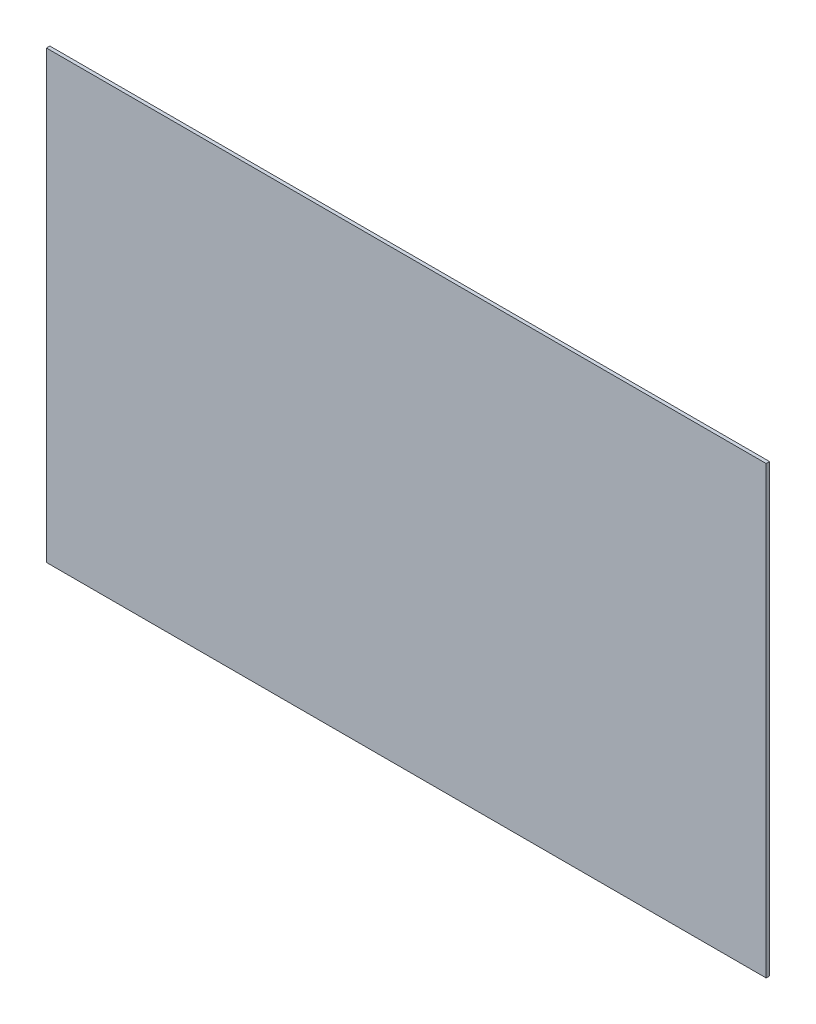
ISO-10303-21;
HEADER;
FILE_DESCRIPTION(('STEP AP214'),'2;1');
FILE_NAME('part.step','',(''),(''),'','','');
FILE_SCHEMA(('AUTOMOTIVE_DESIGN { 1 0 10303 214 1 1 1 1 }'));
ENDSEC;
DATA;
#1=APPLICATION_CONTEXT('core data for automotive mechanical design processes');
#2=APPLICATION_PROTOCOL_DEFINITION('international standard','automotive_design',2000,#1);
#3=PRODUCT_CONTEXT('',#1,'mechanical');
#4=PRODUCT('Part','Part','',(#3));
#5=PRODUCT_RELATED_PRODUCT_CATEGORY('part','',(#4));
#6=PRODUCT_DEFINITION_FORMATION('','',#4);
#7=PRODUCT_DEFINITION_CONTEXT('part definition',#1,'design');
#8=PRODUCT_DEFINITION('design','',#6,#7);
#9=PRODUCT_DEFINITION_SHAPE('','',#8);
#10=(LENGTH_UNIT() NAMED_UNIT(*) SI_UNIT(.MILLI.,.METRE.));
#11=(NAMED_UNIT(*) PLANE_ANGLE_UNIT() SI_UNIT($,.RADIAN.));
#12=(NAMED_UNIT(*) SI_UNIT($,.STERADIAN.) SOLID_ANGLE_UNIT());
#13=UNCERTAINTY_MEASURE_WITH_UNIT(LENGTH_MEASURE(1.E-05),#10,'distance_accuracy_value','');
#14=(GEOMETRIC_REPRESENTATION_CONTEXT(3) GLOBAL_UNCERTAINTY_ASSIGNED_CONTEXT((#13)) GLOBAL_UNIT_ASSIGNED_CONTEXT((#10,
#11,#12)) REPRESENTATION_CONTEXT('',''));
#15=CARTESIAN_POINT('',(0.,0.,0.));
#16=DIRECTION('',(0.,0.,1.));
#17=DIRECTION('',(1.,0.,0.));
#18=AXIS2_PLACEMENT_3D('',#15,#16,#17);
#19=CARTESIAN_POINT('',(0.,0.,0.2));
#20=DIRECTION('',(0.,0.,-1.));
#21=DIRECTION('',(-1.,0.,0.));
#22=AXIS2_PLACEMENT_3D('',#19,#20,#21);
#23=PLANE('',#22);
#24=DIRECTION('',(0.,1.,0.));
#25=VECTOR('',#24,1.);
#26=CARTESIAN_POINT('',(22.5,12.,0.2));
#27=LINE('',#26,#25);
#28=CARTESIAN_POINT('',(22.5,12.,0.2));
#29=VERTEX_POINT('',#28);
#30=CARTESIAN_POINT('',(22.5,38.,0.2));
#31=VERTEX_POINT('',#30);
#32=EDGE_CURVE('E55',#29,#31,#27,.T.);
#33=ORIENTED_EDGE('',*,*,#32,.F.);
#34=DIRECTION('',(1.,0.,0.));
#35=VECTOR('',#34,1.);
#36=CARTESIAN_POINT('',(64.5,12.,0.2));
#37=LINE('',#36,#35);
#38=CARTESIAN_POINT('',(64.5,12.,0.2));
#39=VERTEX_POINT('',#38);
#40=EDGE_CURVE('E20',#39,#29,#37,.F.);
#41=ORIENTED_EDGE('',*,*,#40,.F.);
#42=DIRECTION('',(0.,1.,0.));
#43=VECTOR('',#42,1.);
#44=CARTESIAN_POINT('',(64.5,38.,0.2));
#45=LINE('',#44,#43);
#46=CARTESIAN_POINT('',(64.5,38.,0.2));
#47=VERTEX_POINT('',#46);
#48=EDGE_CURVE('E80',#47,#39,#45,.F.);
#49=ORIENTED_EDGE('',*,*,#48,.F.);
#50=DIRECTION('',(1.,0.,0.));
#51=VECTOR('',#50,1.);
#52=CARTESIAN_POINT('',(22.5,38.,0.2));
#53=LINE('',#52,#51);
#54=EDGE_CURVE('E68',#31,#47,#53,.T.);
#55=ORIENTED_EDGE('',*,*,#54,.F.);
#56=EDGE_LOOP('',(#33,#41,#49,#55));
#57=FACE_BOUND('',#56,.T.);
#58=ADVANCED_FACE('F17',(#57),#23,.F.);
#59=CARTESIAN_POINT('',(64.5,12.,0.));
#60=DIRECTION('',(0.,-1.,0.));
#61=DIRECTION('',(0.,0.,-1.));
#62=AXIS2_PLACEMENT_3D('',#59,#60,#61);
#63=PLANE('',#62);
#64=DIRECTION('',(0.,0.,1.));
#65=VECTOR('',#64,1.);
#66=CARTESIAN_POINT('',(22.5,12.,0.));
#67=LINE('',#66,#65);
#68=CARTESIAN_POINT('',(22.5,12.,0.));
#69=VERTEX_POINT('',#68);
#70=EDGE_CURVE('E61',#69,#29,#67,.T.);
#71=ORIENTED_EDGE('',*,*,#70,.F.);
#72=DIRECTION('',(-1.,0.,0.));
#73=VECTOR('',#72,1.);
#74=CARTESIAN_POINT('',(0.,12.,0.));
#75=LINE('',#74,#73);
#76=CARTESIAN_POINT('',(64.5,12.,0.));
#77=VERTEX_POINT('',#76);
#78=EDGE_CURVE('E83',#77,#69,#75,.T.);
#79=ORIENTED_EDGE('',*,*,#78,.F.);
#80=DIRECTION('',(0.,0.,-1.));
#81=VECTOR('',#80,1.);
#82=CARTESIAN_POINT('',(64.5,12.,0.));
#83=LINE('',#82,#81);
#84=EDGE_CURVE('E64',#39,#77,#83,.T.);
#85=ORIENTED_EDGE('',*,*,#84,.F.);
#86=ORIENTED_EDGE('',*,*,#40,.T.);
#87=EDGE_LOOP('',(#71,#79,#85,#86));
#88=FACE_BOUND('',#87,.T.);
#89=ADVANCED_FACE('F60',(#88),#63,.T.);
#90=CARTESIAN_POINT('',(22.5,12.,0.));
#91=DIRECTION('',(-1.,0.,0.));
#92=DIRECTION('',(0.,0.,1.));
#93=AXIS2_PLACEMENT_3D('',#90,#91,#92);
#94=PLANE('',#93);
#95=DIRECTION('',(0.,0.,1.));
#96=VECTOR('',#95,1.);
#97=CARTESIAN_POINT('',(22.5,38.,0.));
#98=LINE('',#97,#96);
#99=CARTESIAN_POINT('',(22.5,38.,0.));
#100=VERTEX_POINT('',#99);
#101=EDGE_CURVE('E70',#100,#31,#98,.T.);
#102=ORIENTED_EDGE('',*,*,#101,.F.);
#103=DIRECTION('',(0.,1.,0.));
#104=VECTOR('',#103,1.);
#105=CARTESIAN_POINT('',(22.5,0.,0.));
#106=LINE('',#105,#104);
#107=EDGE_CURVE('E74',#69,#100,#106,.T.);
#108=ORIENTED_EDGE('',*,*,#107,.F.);
#109=ORIENTED_EDGE('',*,*,#70,.T.);
#110=ORIENTED_EDGE('',*,*,#32,.T.);
#111=EDGE_LOOP('',(#102,#108,#109,#110));
#112=FACE_BOUND('',#111,.T.);
#113=ADVANCED_FACE('F72',(#112),#94,.T.);
#114=CARTESIAN_POINT('',(22.5,38.,0.));
#115=DIRECTION('',(0.,1.,0.));
#116=DIRECTION('',(0.,0.,1.));
#117=AXIS2_PLACEMENT_3D('',#114,#115,#116);
#118=PLANE('',#117);
#119=DIRECTION('',(0.,0.,-1.));
#120=VECTOR('',#119,1.);
#121=CARTESIAN_POINT('',(64.5,38.,0.));
#122=LINE('',#121,#120);
#123=CARTESIAN_POINT('',(64.5,38.,0.));
#124=VERTEX_POINT('',#123);
#125=EDGE_CURVE('E35',#124,#47,#122,.F.);
#126=ORIENTED_EDGE('',*,*,#125,.F.);
#127=DIRECTION('',(-1.,0.,0.));
#128=VECTOR('',#127,1.);
#129=CARTESIAN_POINT('',(0.,38.,0.));
#130=LINE('',#129,#128);
#131=EDGE_CURVE('E26',#100,#124,#130,.F.);
#132=ORIENTED_EDGE('',*,*,#131,.F.);
#133=ORIENTED_EDGE('',*,*,#101,.T.);
#134=ORIENTED_EDGE('',*,*,#54,.T.);
#135=EDGE_LOOP('',(#126,#132,#133,#134));
#136=FACE_BOUND('',#135,.T.);
#137=ADVANCED_FACE('F89',(#136),#118,.T.);
#138=CARTESIAN_POINT('',(64.5,38.,0.));
#139=DIRECTION('',(1.,0.,0.));
#140=DIRECTION('',(0.,0.,-1.));
#141=AXIS2_PLACEMENT_3D('',#138,#139,#140);
#142=PLANE('',#141);
#143=ORIENTED_EDGE('',*,*,#84,.T.);
#144=DIRECTION('',(0.,1.,0.));
#145=VECTOR('',#144,1.);
#146=CARTESIAN_POINT('',(64.5,0.,0.));
#147=LINE('',#146,#145);
#148=EDGE_CURVE('E11',#124,#77,#147,.F.);
#149=ORIENTED_EDGE('',*,*,#148,.F.);
#150=ORIENTED_EDGE('',*,*,#125,.T.);
#151=ORIENTED_EDGE('',*,*,#48,.T.);
#152=EDGE_LOOP('',(#143,#149,#150,#151));
#153=FACE_BOUND('',#152,.T.);
#154=ADVANCED_FACE('F91',(#153),#142,.T.);
#155=CARTESIAN_POINT('',(0.,0.,0.));
#156=DIRECTION('',(0.,0.,-1.));
#157=DIRECTION('',(-1.,0.,0.));
#158=AXIS2_PLACEMENT_3D('',#155,#156,#157);
#159=PLANE('',#158);
#160=ORIENTED_EDGE('',*,*,#131,.T.);
#161=ORIENTED_EDGE('',*,*,#148,.T.);
#162=ORIENTED_EDGE('',*,*,#78,.T.);
#163=ORIENTED_EDGE('',*,*,#107,.T.);
#164=EDGE_LOOP('',(#160,#161,#162,#163));
#165=FACE_BOUND('',#164,.T.);
#166=ADVANCED_FACE('F88',(#165),#159,.T.);
#167=CLOSED_SHELL('',(#58,#89,#113,#137,#154,#166));
#168=MANIFOLD_SOLID_BREP('B1',#167);
#169=ADVANCED_BREP_SHAPE_REPRESENTATION('',(#18,#168),#14);
#170=SHAPE_DEFINITION_REPRESENTATION(#9,#169);
ENDSEC;
END-ISO-10303-21;
